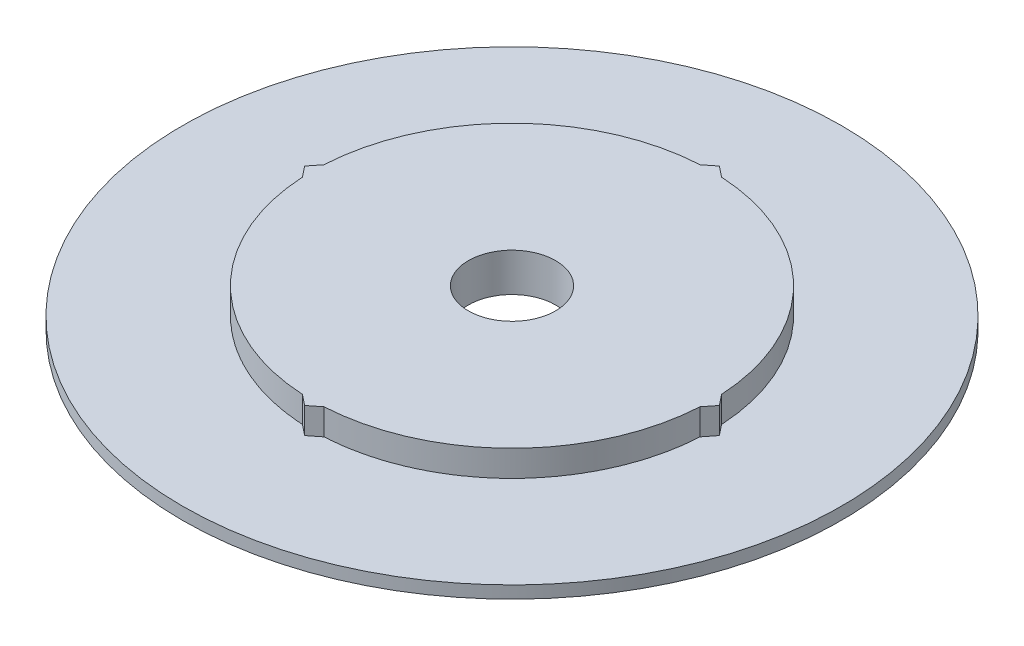
ISO-10303-21;
HEADER;
FILE_DESCRIPTION(('STEP AP214'),'2;1');
FILE_NAME('part.step','',(''),(''),'','','');
FILE_SCHEMA(('AUTOMOTIVE_DESIGN { 1 0 10303 214 1 1 1 1 }'));
ENDSEC;
DATA;
#1=APPLICATION_CONTEXT('core data for automotive mechanical design processes');
#2=APPLICATION_PROTOCOL_DEFINITION('international standard','automotive_design',2000,#1);
#3=PRODUCT_CONTEXT('',#1,'mechanical');
#4=PRODUCT('Part','Part','',(#3));
#5=PRODUCT_RELATED_PRODUCT_CATEGORY('part','',(#4));
#6=PRODUCT_DEFINITION_FORMATION('','',#4);
#7=PRODUCT_DEFINITION_CONTEXT('part definition',#1,'design');
#8=PRODUCT_DEFINITION('design','',#6,#7);
#9=PRODUCT_DEFINITION_SHAPE('','',#8);
#10=(LENGTH_UNIT() NAMED_UNIT(*) SI_UNIT(.MILLI.,.METRE.));
#11=(NAMED_UNIT(*) PLANE_ANGLE_UNIT() SI_UNIT($,.RADIAN.));
#12=(NAMED_UNIT(*) SI_UNIT($,.STERADIAN.) SOLID_ANGLE_UNIT());
#13=UNCERTAINTY_MEASURE_WITH_UNIT(LENGTH_MEASURE(1.E-05),#10,'distance_accuracy_value','');
#14=(GEOMETRIC_REPRESENTATION_CONTEXT(3) GLOBAL_UNCERTAINTY_ASSIGNED_CONTEXT((#13)) GLOBAL_UNIT_ASSIGNED_CONTEXT((#10,
#11,#12)) REPRESENTATION_CONTEXT('',''));
#15=CARTESIAN_POINT('',(0.,0.,0.));
#16=DIRECTION('',(0.,0.,1.));
#17=DIRECTION('',(1.,0.,0.));
#18=AXIS2_PLACEMENT_3D('',#15,#16,#17);
#19=CARTESIAN_POINT('',(0.,2.8,0.));
#20=DIRECTION('',(0.,-1.,0.));
#21=DIRECTION('',(0.,0.,-1.));
#22=AXIS2_PLACEMENT_3D('',#19,#20,#21);
#23=CYLINDRICAL_SURFACE('',#22,14.5);
#24=DIRECTION('',(0.,1.,0.));
#25=VECTOR('',#24,1.);
#26=CARTESIAN_POINT('',(-0.78365836517871,-1.68593039593662,14.4788079470199));
#27=LINE('',#26,#25);
#28=CARTESIAN_POINT('',(-0.783658365178711,0.,14.4788079470199));
#29=VERTEX_POINT('',#28);
#30=CARTESIAN_POINT('',(-0.78365836517871,2.8,14.4788079470199));
#31=VERTEX_POINT('',#30);
#32=EDGE_CURVE('E61',#29,#31,#27,.T.);
#33=ORIENTED_EDGE('',*,*,#32,.T.);
#34=CARTESIAN_POINT('',(0.,2.8,0.));
#35=DIRECTION('',(0.,-1.,0.));
#36=DIRECTION('',(0.,0.,-1.));
#37=AXIS2_PLACEMENT_3D('',#34,#35,#36);
#38=CIRCLE('',#37,14.5);
#39=CARTESIAN_POINT('',(-14.4788079470199,2.8,0.783658365178552));
#40=VERTEX_POINT('',#39);
#41=EDGE_CURVE('E54',#31,#40,#38,.T.);
#42=ORIENTED_EDGE('',*,*,#41,.T.);
#43=DIRECTION('',(0.,1.,0.));
#44=VECTOR('',#43,1.);
#45=CARTESIAN_POINT('',(-14.4788079470199,-1.68593039593662,0.783658365178552));
#46=LINE('',#45,#44);
#47=CARTESIAN_POINT('',(-14.4788079470199,0.,0.783658365178552));
#48=VERTEX_POINT('',#47);
#49=EDGE_CURVE('E205',#48,#40,#46,.T.);
#50=ORIENTED_EDGE('',*,*,#49,.F.);
#51=CARTESIAN_POINT('',(0.,0.,0.));
#52=DIRECTION('',(0.,-1.,0.));
#53=DIRECTION('',(0.,0.,-1.));
#54=AXIS2_PLACEMENT_3D('',#51,#52,#53);
#55=CIRCLE('',#54,14.5);
#56=EDGE_CURVE('E219',#29,#48,#55,.T.);
#57=ORIENTED_EDGE('',*,*,#56,.F.);
#58=EDGE_LOOP('',(#33,#42,#50,#57));
#59=FACE_BOUND('',#58,.T.);
#60=ADVANCED_FACE('F44',(#59),#23,.T.);
#61=DIRECTION('',(0.,1.,0.));
#62=VECTOR('',#61,1.);
#63=CARTESIAN_POINT('',(0.7836583651784,-1.68593039593662,14.4788079470199));
#64=LINE('',#63,#62);
#65=CARTESIAN_POINT('',(0.7836583651784,0.,14.4788079470199));
#66=VERTEX_POINT('',#65);
#67=CARTESIAN_POINT('',(0.7836583651784,2.8,14.4788079470199));
#68=VERTEX_POINT('',#67);
#69=EDGE_CURVE('E148',#66,#68,#64,.T.);
#70=ORIENTED_EDGE('',*,*,#69,.F.);
#71=CARTESIAN_POINT('',(14.4788079470199,0.,0.783658365178658));
#72=VERTEX_POINT('',#71);
#73=EDGE_CURVE('E238',#72,#66,#55,.T.);
#74=ORIENTED_EDGE('',*,*,#73,.F.);
#75=DIRECTION('',(0.,1.,0.));
#76=VECTOR('',#75,1.);
#77=CARTESIAN_POINT('',(14.4788079470199,-1.68593039593662,0.783658365178659));
#78=LINE('',#77,#76);
#79=CARTESIAN_POINT('',(14.4788079470199,2.8,0.783658365178659));
#80=VERTEX_POINT('',#79);
#81=EDGE_CURVE('E69',#72,#80,#78,.T.);
#82=ORIENTED_EDGE('',*,*,#81,.T.);
#83=EDGE_CURVE('E236',#80,#68,#38,.T.);
#84=ORIENTED_EDGE('',*,*,#83,.T.);
#85=EDGE_LOOP('',(#70,#74,#82,#84));
#86=FACE_BOUND('',#85,.T.);
#87=ADVANCED_FACE('F243',(#86),#23,.T.);
#88=DIRECTION('',(0.,1.,0.));
#89=VECTOR('',#88,1.);
#90=CARTESIAN_POINT('',(14.4788079470199,-1.68593039593662,-0.783658365178457));
#91=LINE('',#90,#89);
#92=CARTESIAN_POINT('',(14.4788079470199,0.,-0.783658365178457));
#93=VERTEX_POINT('',#92);
#94=CARTESIAN_POINT('',(14.4788079470199,2.8,-0.783658365178457));
#95=VERTEX_POINT('',#94);
#96=EDGE_CURVE('E171',#93,#95,#91,.T.);
#97=ORIENTED_EDGE('',*,*,#96,.F.);
#98=CARTESIAN_POINT('',(0.783658365178611,0.,-14.4788079470199));
#99=VERTEX_POINT('',#98);
#100=EDGE_CURVE('E235',#99,#93,#55,.T.);
#101=ORIENTED_EDGE('',*,*,#100,.F.);
#102=DIRECTION('',(0.,1.,0.));
#103=VECTOR('',#102,1.);
#104=CARTESIAN_POINT('',(0.78365836517861,-1.68593039593662,-14.4788079470199));
#105=LINE('',#104,#103);
#106=CARTESIAN_POINT('',(0.78365836517861,2.8,-14.4788079470199));
#107=VERTEX_POINT('',#106);
#108=EDGE_CURVE('E182',#99,#107,#105,.T.);
#109=ORIENTED_EDGE('',*,*,#108,.T.);
#110=EDGE_CURVE('E53',#107,#95,#38,.T.);
#111=ORIENTED_EDGE('',*,*,#110,.T.);
#112=EDGE_LOOP('',(#97,#101,#109,#111));
#113=FACE_BOUND('',#112,.T.);
#114=ADVANCED_FACE('F248',(#113),#23,.T.);
#115=DIRECTION('',(0.,1.,0.));
#116=VECTOR('',#115,1.);
#117=CARTESIAN_POINT('',(-0.783658365178501,-1.68593039593662,-14.4788079470199));
#118=LINE('',#117,#116);
#119=CARTESIAN_POINT('',(-0.783658365178501,0.,-14.4788079470199));
#120=VERTEX_POINT('',#119);
#121=CARTESIAN_POINT('',(-0.783658365178501,2.8,-14.4788079470199));
#122=VERTEX_POINT('',#121);
#123=EDGE_CURVE('E187',#120,#122,#118,.T.);
#124=ORIENTED_EDGE('',*,*,#123,.F.);
#125=CARTESIAN_POINT('',(-14.4788079470199,0.,-0.783658365178561));
#126=VERTEX_POINT('',#125);
#127=EDGE_CURVE('E48',#126,#120,#55,.T.);
#128=ORIENTED_EDGE('',*,*,#127,.F.);
#129=DIRECTION('',(0.,1.,0.));
#130=VECTOR('',#129,1.);
#131=CARTESIAN_POINT('',(-14.4788079470199,-1.68593039593662,-0.783658365178558));
#132=LINE('',#131,#130);
#133=CARTESIAN_POINT('',(-14.4788079470199,2.8,-0.783658365178558));
#134=VERTEX_POINT('',#133);
#135=EDGE_CURVE('E200',#126,#134,#132,.T.);
#136=ORIENTED_EDGE('',*,*,#135,.T.);
#137=EDGE_CURVE('E12',#134,#122,#38,.T.);
#138=ORIENTED_EDGE('',*,*,#137,.T.);
#139=EDGE_LOOP('',(#124,#128,#136,#138));
#140=FACE_BOUND('',#139,.T.);
#141=ADVANCED_FACE('F46',(#140),#23,.T.);
#142=CARTESIAN_POINT('',(0.,2.8,0.));
#143=DIRECTION('',(0.,-1.,0.));
#144=DIRECTION('',(0.,0.,-1.));
#145=AXIS2_PLACEMENT_3D('',#142,#143,#144);
#146=PLANE('',#145);
#147=CARTESIAN_POINT('',(0.,2.8,0.));
#148=DIRECTION('',(0.,-1.,0.));
#149=DIRECTION('',(0.,0.,-1.));
#150=AXIS2_PLACEMENT_3D('',#147,#148,#149);
#151=CIRCLE('',#150,3.175);
#152=CARTESIAN_POINT('',(0.,2.8,-3.175));
#153=VERTEX_POINT('',#152);
#154=EDGE_CURVE('E216',#153,#153,#151,.T.);
#155=ORIENTED_EDGE('',*,*,#154,.T.);
#156=EDGE_LOOP('',(#155));
#157=FACE_BOUND('',#156,.T.);
#158=ORIENTED_EDGE('',*,*,#137,.F.);
#159=DIRECTION('',(-0.621192052980132,0.,0.783658365178557));
#160=VECTOR('',#159,1.);
#161=CARTESIAN_POINT('',(-15.1,2.8,0.));
#162=LINE('',#161,#160);
#163=CARTESIAN_POINT('',(-15.1,2.8,0.));
#164=VERTEX_POINT('',#163);
#165=EDGE_CURVE('E197',#134,#164,#162,.T.);
#166=ORIENTED_EDGE('',*,*,#165,.T.);
#167=DIRECTION('',(0.621192052980132,0.,0.783658365178557));
#168=VECTOR('',#167,1.);
#169=CARTESIAN_POINT('',(-15.1,2.8,0.));
#170=LINE('',#169,#168);
#171=EDGE_CURVE('E196',#164,#40,#170,.T.);
#172=ORIENTED_EDGE('',*,*,#171,.T.);
#173=ORIENTED_EDGE('',*,*,#41,.F.);
#174=DIRECTION('',(0.783658365178551,0.,0.62119205298014));
#175=VECTOR('',#174,1.);
#176=CARTESIAN_POINT('',(-1.58090625841645E-13,2.8,15.1));
#177=LINE('',#176,#175);
#178=CARTESIAN_POINT('',(-1.58090625841645E-13,2.8,15.1));
#179=VERTEX_POINT('',#178);
#180=EDGE_CURVE('E139',#31,#179,#177,.T.);
#181=ORIENTED_EDGE('',*,*,#180,.T.);
#182=DIRECTION('',(0.783658365178564,0.,-0.621192052980123));
#183=VECTOR('',#182,1.);
#184=CARTESIAN_POINT('',(-1.58090625841645E-13,2.8,15.1));
#185=LINE('',#184,#183);
#186=EDGE_CURVE('E145',#179,#68,#185,.T.);
#187=ORIENTED_EDGE('',*,*,#186,.T.);
#188=ORIENTED_EDGE('',*,*,#83,.F.);
#189=DIRECTION('',(0.621192052980137,0.,-0.783658365178553));
#190=VECTOR('',#189,1.);
#191=CARTESIAN_POINT('',(15.1,2.8,1.05152417190617E-13));
#192=LINE('',#191,#190);
#193=CARTESIAN_POINT('',(15.1,2.8,1.05152417190617E-13));
#194=VERTEX_POINT('',#193);
#195=EDGE_CURVE('E164',#80,#194,#192,.T.);
#196=ORIENTED_EDGE('',*,*,#195,.T.);
#197=DIRECTION('',(-0.621192052980126,0.,-0.783658365178562));
#198=VECTOR('',#197,1.);
#199=CARTESIAN_POINT('',(15.1,2.8,1.05152417190617E-13));
#200=LINE('',#199,#198);
#201=EDGE_CURVE('E163',#194,#95,#200,.T.);
#202=ORIENTED_EDGE('',*,*,#201,.T.);
#203=ORIENTED_EDGE('',*,*,#110,.F.);
#204=DIRECTION('',(-0.783658365178555,0.,-0.621192052980135));
#205=VECTOR('',#204,1.);
#206=CARTESIAN_POINT('',(0.,2.8,-15.1));
#207=LINE('',#206,#205);
#208=CARTESIAN_POINT('',(0.,2.8,-15.1));
#209=VERTEX_POINT('',#208);
#210=EDGE_CURVE('E179',#107,#209,#207,.T.);
#211=ORIENTED_EDGE('',*,*,#210,.T.);
#212=DIRECTION('',(-0.78365836517856,0.,0.621192052980128));
#213=VECTOR('',#212,1.);
#214=CARTESIAN_POINT('',(0.,2.8,-15.1));
#215=LINE('',#214,#213);
#216=EDGE_CURVE('E178',#209,#122,#215,.T.);
#217=ORIENTED_EDGE('',*,*,#216,.T.);
#218=EDGE_LOOP('',(#158,#166,#172,#173,#181,#187,#188,#196,#202,#203,#211,#217));
#219=FACE_BOUND('',#218,.T.);
#220=ADVANCED_FACE('F155',(#157,#219),#146,.F.);
#221=CARTESIAN_POINT('',(0.,0.,0.));
#222=DIRECTION('',(0.,-1.,0.));
#223=DIRECTION('',(0.,0.,-1.));
#224=AXIS2_PLACEMENT_3D('',#221,#222,#223);
#225=PLANE('',#224);
#226=CARTESIAN_POINT('',(0.,0.,0.));
#227=DIRECTION('',(0.,-1.,0.));
#228=DIRECTION('',(0.,0.,-1.));
#229=AXIS2_PLACEMENT_3D('',#226,#227,#228);
#230=CIRCLE('',#229,3.175);
#231=CARTESIAN_POINT('',(0.,0.,-3.175));
#232=VERTEX_POINT('',#231);
#233=EDGE_CURVE('E215',#232,#232,#230,.T.);
#234=ORIENTED_EDGE('',*,*,#233,.F.);
#235=EDGE_LOOP('',(#234));
#236=FACE_BOUND('',#235,.T.);
#237=ORIENTED_EDGE('',*,*,#127,.T.);
#238=DIRECTION('',(-0.78365836517856,0.,0.621192052980128));
#239=VECTOR('',#238,1.);
#240=CARTESIAN_POINT('',(0.,0.,-15.1));
#241=LINE('',#240,#239);
#242=CARTESIAN_POINT('',(0.,0.,-15.1));
#243=VERTEX_POINT('',#242);
#244=EDGE_CURVE('E185',#243,#120,#241,.T.);
#245=ORIENTED_EDGE('',*,*,#244,.F.);
#246=DIRECTION('',(-0.783658365178555,0.,-0.621192052980135));
#247=VECTOR('',#246,1.);
#248=CARTESIAN_POINT('',(0.,0.,-15.1));
#249=LINE('',#248,#247);
#250=EDGE_CURVE('E189',#99,#243,#249,.T.);
#251=ORIENTED_EDGE('',*,*,#250,.F.);
#252=ORIENTED_EDGE('',*,*,#100,.T.);
#253=DIRECTION('',(-0.621192052980126,0.,-0.783658365178562));
#254=VECTOR('',#253,1.);
#255=CARTESIAN_POINT('',(15.1,0.,1.05152417190617E-13));
#256=LINE('',#255,#254);
#257=CARTESIAN_POINT('',(15.1,0.,1.05152417190617E-13));
#258=VERTEX_POINT('',#257);
#259=EDGE_CURVE('E169',#258,#93,#256,.T.);
#260=ORIENTED_EDGE('',*,*,#259,.F.);
#261=DIRECTION('',(0.621192052980137,0.,-0.783658365178553));
#262=VECTOR('',#261,1.);
#263=CARTESIAN_POINT('',(15.1,0.,1.05152417190617E-13));
#264=LINE('',#263,#262);
#265=EDGE_CURVE('E173',#72,#258,#264,.T.);
#266=ORIENTED_EDGE('',*,*,#265,.F.);
#267=ORIENTED_EDGE('',*,*,#73,.T.);
#268=DIRECTION('',(0.783658365178564,0.,-0.621192052980123));
#269=VECTOR('',#268,1.);
#270=CARTESIAN_POINT('',(-1.58090625841645E-13,0.,15.1));
#271=LINE('',#270,#269);
#272=CARTESIAN_POINT('',(-1.58090625841645E-13,0.,15.1));
#273=VERTEX_POINT('',#272);
#274=EDGE_CURVE('E142',#273,#66,#271,.T.);
#275=ORIENTED_EDGE('',*,*,#274,.F.);
#276=DIRECTION('',(0.783658365178551,0.,0.62119205298014));
#277=VECTOR('',#276,1.);
#278=CARTESIAN_POINT('',(-1.58090625841645E-13,0.,15.1));
#279=LINE('',#278,#277);
#280=EDGE_CURVE('E140',#29,#273,#279,.T.);
#281=ORIENTED_EDGE('',*,*,#280,.F.);
#282=ORIENTED_EDGE('',*,*,#56,.T.);
#283=DIRECTION('',(0.621192052980132,0.,0.783658365178558));
#284=VECTOR('',#283,1.);
#285=CARTESIAN_POINT('',(-15.1,0.,0.));
#286=LINE('',#285,#284);
#287=CARTESIAN_POINT('',(-15.1,0.,0.));
#288=VERTEX_POINT('',#287);
#289=EDGE_CURVE('E202',#288,#48,#286,.T.);
#290=ORIENTED_EDGE('',*,*,#289,.F.);
#291=DIRECTION('',(-0.621192052980132,0.,0.783658365178558));
#292=VECTOR('',#291,1.);
#293=CARTESIAN_POINT('',(-15.1,0.,0.));
#294=LINE('',#293,#292);
#295=EDGE_CURVE('E207',#126,#288,#294,.T.);
#296=ORIENTED_EDGE('',*,*,#295,.F.);
#297=EDGE_LOOP('',(#237,#245,#251,#252,#260,#266,#267,#275,#281,#282,#290,#296));
#298=FACE_BOUND('',#297,.T.);
#299=ADVANCED_FACE('F225',(#236,#298),#225,.T.);
#300=CARTESIAN_POINT('',(0.,2.8,0.));
#301=DIRECTION('',(0.,-1.,0.));
#302=DIRECTION('',(0.,0.,-1.));
#303=AXIS2_PLACEMENT_3D('',#300,#301,#302);
#304=CYLINDRICAL_SURFACE('',#303,3.175);
#305=ORIENTED_EDGE('',*,*,#154,.F.);
#306=EDGE_LOOP('',(#305));
#307=FACE_BOUND('',#306,.T.);
#308=ORIENTED_EDGE('',*,*,#233,.T.);
#309=EDGE_LOOP('',(#308));
#310=FACE_BOUND('',#309,.T.);
#311=ADVANCED_FACE('F223',(#307,#310),#304,.F.);
#312=CARTESIAN_POINT('',(-15.1,-1.68593039593662,0.));
#313=DIRECTION('',(-0.783658365178557,0.,-0.621192052980132));
#314=DIRECTION('',(-0.621192052980132,0.,0.783658365178558));
#315=AXIS2_PLACEMENT_3D('',#312,#313,#314);
#316=PLANE('',#315);
#317=ORIENTED_EDGE('',*,*,#135,.F.);
#318=ORIENTED_EDGE('',*,*,#295,.T.);
#319=DIRECTION('',(0.,1.,0.));
#320=VECTOR('',#319,1.);
#321=CARTESIAN_POINT('',(-15.1,-1.68593039593662,0.));
#322=LINE('',#321,#320);
#323=EDGE_CURVE('E206',#288,#164,#322,.T.);
#324=ORIENTED_EDGE('',*,*,#323,.T.);
#325=ORIENTED_EDGE('',*,*,#165,.F.);
#326=EDGE_LOOP('',(#317,#318,#324,#325));
#327=FACE_BOUND('',#326,.T.);
#328=ADVANCED_FACE('F260',(#327),#316,.T.);
#329=CARTESIAN_POINT('',(-15.1,-1.68593039593662,0.));
#330=DIRECTION('',(-0.783658365178557,0.,0.621192052980132));
#331=DIRECTION('',(0.621192052980132,0.,0.783658365178558));
#332=AXIS2_PLACEMENT_3D('',#329,#330,#331);
#333=PLANE('',#332);
#334=ORIENTED_EDGE('',*,*,#323,.F.);
#335=ORIENTED_EDGE('',*,*,#289,.T.);
#336=ORIENTED_EDGE('',*,*,#49,.T.);
#337=ORIENTED_EDGE('',*,*,#171,.F.);
#338=EDGE_LOOP('',(#334,#335,#336,#337));
#339=FACE_BOUND('',#338,.T.);
#340=ADVANCED_FACE('F264',(#339),#333,.T.);
#341=CARTESIAN_POINT('',(0.,-1.68593039593662,-15.1));
#342=DIRECTION('',(0.621192052980135,0.,-0.783658365178555));
#343=DIRECTION('',(-0.783658365178555,0.,-0.621192052980135));
#344=AXIS2_PLACEMENT_3D('',#341,#342,#343);
#345=PLANE('',#344);
#346=ORIENTED_EDGE('',*,*,#108,.F.);
#347=ORIENTED_EDGE('',*,*,#250,.T.);
#348=DIRECTION('',(0.,1.,0.));
#349=VECTOR('',#348,1.);
#350=CARTESIAN_POINT('',(0.,-1.68593039593662,-15.1));
#351=LINE('',#350,#349);
#352=EDGE_CURVE('E188',#243,#209,#351,.T.);
#353=ORIENTED_EDGE('',*,*,#352,.T.);
#354=ORIENTED_EDGE('',*,*,#210,.F.);
#355=EDGE_LOOP('',(#346,#347,#353,#354));
#356=FACE_BOUND('',#355,.T.);
#357=ADVANCED_FACE('F255',(#356),#345,.T.);
#358=CARTESIAN_POINT('',(0.,-1.68593039593662,-15.1));
#359=DIRECTION('',(-0.621192052980128,0.,-0.78365836517856));
#360=DIRECTION('',(-0.78365836517856,0.,0.621192052980128));
#361=AXIS2_PLACEMENT_3D('',#358,#359,#360);
#362=PLANE('',#361);
#363=ORIENTED_EDGE('',*,*,#352,.F.);
#364=ORIENTED_EDGE('',*,*,#244,.T.);
#365=ORIENTED_EDGE('',*,*,#123,.T.);
#366=ORIENTED_EDGE('',*,*,#216,.F.);
#367=EDGE_LOOP('',(#363,#364,#365,#366));
#368=FACE_BOUND('',#367,.T.);
#369=ADVANCED_FACE('F258',(#368),#362,.T.);
#370=CARTESIAN_POINT('',(15.1,-1.68593039593662,1.05152417190617E-13));
#371=DIRECTION('',(0.783658365178553,0.,0.621192052980137));
#372=DIRECTION('',(0.621192052980137,0.,-0.783658365178553));
#373=AXIS2_PLACEMENT_3D('',#370,#371,#372);
#374=PLANE('',#373);
#375=ORIENTED_EDGE('',*,*,#81,.F.);
#376=ORIENTED_EDGE('',*,*,#265,.T.);
#377=DIRECTION('',(0.,1.,0.));
#378=VECTOR('',#377,1.);
#379=CARTESIAN_POINT('',(15.1,-1.68593039593662,1.05152417190617E-13));
#380=LINE('',#379,#378);
#381=EDGE_CURVE('E172',#258,#194,#380,.T.);
#382=ORIENTED_EDGE('',*,*,#381,.T.);
#383=ORIENTED_EDGE('',*,*,#195,.F.);
#384=EDGE_LOOP('',(#375,#376,#382,#383));
#385=FACE_BOUND('',#384,.T.);
#386=ADVANCED_FACE('F327',(#385),#374,.T.);
#387=CARTESIAN_POINT('',(15.1,-1.68593039593662,1.05152417190617E-13));
#388=DIRECTION('',(0.783658365178562,0.,-0.621192052980126));
#389=DIRECTION('',(-0.621192052980126,0.,-0.783658365178562));
#390=AXIS2_PLACEMENT_3D('',#387,#388,#389);
#391=PLANE('',#390);
#392=ORIENTED_EDGE('',*,*,#381,.F.);
#393=ORIENTED_EDGE('',*,*,#259,.T.);
#394=ORIENTED_EDGE('',*,*,#96,.T.);
#395=ORIENTED_EDGE('',*,*,#201,.F.);
#396=EDGE_LOOP('',(#392,#393,#394,#395));
#397=FACE_BOUND('',#396,.T.);
#398=ADVANCED_FACE('F253',(#397),#391,.T.);
#399=CARTESIAN_POINT('',(-1.58090625841645E-13,-1.68593039593662,15.1));
#400=DIRECTION('',(-0.62119205298014,0.,0.783658365178551));
#401=DIRECTION('',(0.783658365178551,0.,0.62119205298014));
#402=AXIS2_PLACEMENT_3D('',#399,#400,#401);
#403=PLANE('',#402);
#404=ORIENTED_EDGE('',*,*,#32,.F.);
#405=ORIENTED_EDGE('',*,*,#280,.T.);
#406=DIRECTION('',(0.,1.,0.));
#407=VECTOR('',#406,1.);
#408=CARTESIAN_POINT('',(-1.58090625841645E-13,-1.68593039593662,15.1));
#409=LINE('',#408,#407);
#410=EDGE_CURVE('E135',#273,#179,#409,.T.);
#411=ORIENTED_EDGE('',*,*,#410,.T.);
#412=ORIENTED_EDGE('',*,*,#180,.F.);
#413=EDGE_LOOP('',(#404,#405,#411,#412));
#414=FACE_BOUND('',#413,.T.);
#415=ADVANCED_FACE('F137',(#414),#403,.T.);
#416=CARTESIAN_POINT('',(-1.58090625841645E-13,-1.68593039593662,15.1));
#417=DIRECTION('',(0.621192052980123,0.,0.783658365178564));
#418=DIRECTION('',(0.783658365178564,0.,-0.621192052980123));
#419=AXIS2_PLACEMENT_3D('',#416,#417,#418);
#420=PLANE('',#419);
#421=ORIENTED_EDGE('',*,*,#410,.F.);
#422=ORIENTED_EDGE('',*,*,#274,.T.);
#423=ORIENTED_EDGE('',*,*,#69,.T.);
#424=ORIENTED_EDGE('',*,*,#186,.F.);
#425=EDGE_LOOP('',(#421,#422,#423,#424));
#426=FACE_BOUND('',#425,.T.);
#427=ADVANCED_FACE('F146',(#426),#420,.T.);
#428=CLOSED_SHELL('',(#60,#87,#114,#141,#220,#299,#311,#328,#340,#357,#369,#386,#398,#415,#427));
#429=MANIFOLD_SOLID_BREP('B2',#428);
#430=CARTESIAN_POINT('',(0.,0.9,0.));
#431=DIRECTION('',(0.,1.,0.));
#432=DIRECTION('',(0.,0.,1.));
#433=AXIS2_PLACEMENT_3D('',#430,#431,#432);
#434=PLANE('',#433);
#435=CARTESIAN_POINT('',(0.,0.9,0.));
#436=DIRECTION('',(0.,1.,0.));
#437=DIRECTION('',(0.,0.,1.));
#438=AXIS2_PLACEMENT_3D('',#435,#436,#437);
#439=CIRCLE('',#438,24.);
#440=CARTESIAN_POINT('',(0.,0.9,24.));
#441=VERTEX_POINT('',#440);
#442=EDGE_CURVE('E43',#441,#441,#439,.T.);
#443=ORIENTED_EDGE('',*,*,#442,.T.);
#444=EDGE_LOOP('',(#443));
#445=FACE_BOUND('',#444,.T.);
#446=CARTESIAN_POINT('',(0.,0.9,0.));
#447=DIRECTION('',(0.,1.,0.));
#448=DIRECTION('',(0.,0.,1.));
#449=AXIS2_PLACEMENT_3D('',#446,#447,#448);
#450=CIRCLE('',#449,14.5);
#451=CARTESIAN_POINT('',(0.,0.9,14.5));
#452=VERTEX_POINT('',#451);
#453=EDGE_CURVE('E422',#452,#452,#450,.T.);
#454=ORIENTED_EDGE('',*,*,#453,.F.);
#455=EDGE_LOOP('',(#454));
#456=FACE_BOUND('',#455,.T.);
#457=ADVANCED_FACE('F411',(#445,#456),#434,.T.);
#458=CARTESIAN_POINT('',(0.,0.,0.));
#459=DIRECTION('',(0.,1.,0.));
#460=DIRECTION('',(0.,0.,1.));
#461=AXIS2_PLACEMENT_3D('',#458,#459,#460);
#462=PLANE('',#461);
#463=CARTESIAN_POINT('',(0.,0.,0.));
#464=DIRECTION('',(0.,1.,0.));
#465=DIRECTION('',(0.,0.,1.));
#466=AXIS2_PLACEMENT_3D('',#463,#464,#465);
#467=CIRCLE('',#466,24.);
#468=CARTESIAN_POINT('',(0.,0.,24.));
#469=VERTEX_POINT('',#468);
#470=EDGE_CURVE('E415',#469,#469,#467,.T.);
#471=ORIENTED_EDGE('',*,*,#470,.F.);
#472=EDGE_LOOP('',(#471));
#473=FACE_BOUND('',#472,.T.);
#474=CARTESIAN_POINT('',(0.,0.,0.));
#475=DIRECTION('',(0.,1.,0.));
#476=DIRECTION('',(0.,0.,1.));
#477=AXIS2_PLACEMENT_3D('',#474,#475,#476);
#478=CIRCLE('',#477,14.5);
#479=CARTESIAN_POINT('',(0.,0.,14.5));
#480=VERTEX_POINT('',#479);
#481=EDGE_CURVE('E424',#480,#480,#478,.T.);
#482=ORIENTED_EDGE('',*,*,#481,.T.);
#483=EDGE_LOOP('',(#482));
#484=FACE_BOUND('',#483,.T.);
#485=ADVANCED_FACE('F434',(#473,#484),#462,.F.);
#486=CARTESIAN_POINT('',(0.,0.9,0.));
#487=DIRECTION('',(0.,-1.,0.));
#488=DIRECTION('',(0.,0.,-1.));
#489=AXIS2_PLACEMENT_3D('',#486,#487,#488);
#490=CYLINDRICAL_SURFACE('',#489,24.);
#491=ORIENTED_EDGE('',*,*,#442,.F.);
#492=EDGE_LOOP('',(#491));
#493=FACE_BOUND('',#492,.T.);
#494=ORIENTED_EDGE('',*,*,#470,.T.);
#495=EDGE_LOOP('',(#494));
#496=FACE_BOUND('',#495,.T.);
#497=ADVANCED_FACE('F413',(#493,#496),#490,.T.);
#498=CARTESIAN_POINT('',(0.,0.9,0.));
#499=DIRECTION('',(0.,-1.,0.));
#500=DIRECTION('',(0.,0.,-1.));
#501=AXIS2_PLACEMENT_3D('',#498,#499,#500);
#502=CYLINDRICAL_SURFACE('',#501,14.5);
#503=ORIENTED_EDGE('',*,*,#453,.T.);
#504=EDGE_LOOP('',(#503));
#505=FACE_BOUND('',#504,.T.);
#506=ORIENTED_EDGE('',*,*,#481,.F.);
#507=EDGE_LOOP('',(#506));
#508=FACE_BOUND('',#507,.T.);
#509=ADVANCED_FACE('F430',(#505,#508),#502,.F.);
#510=CLOSED_SHELL('',(#457,#485,#497,#509));
#511=MANIFOLD_SOLID_BREP('B6',#510);
#512=ADVANCED_BREP_SHAPE_REPRESENTATION('',(#18,#429,#511),#14);
#513=SHAPE_DEFINITION_REPRESENTATION(#9,#512);
ENDSEC;
END-ISO-10303-21;
